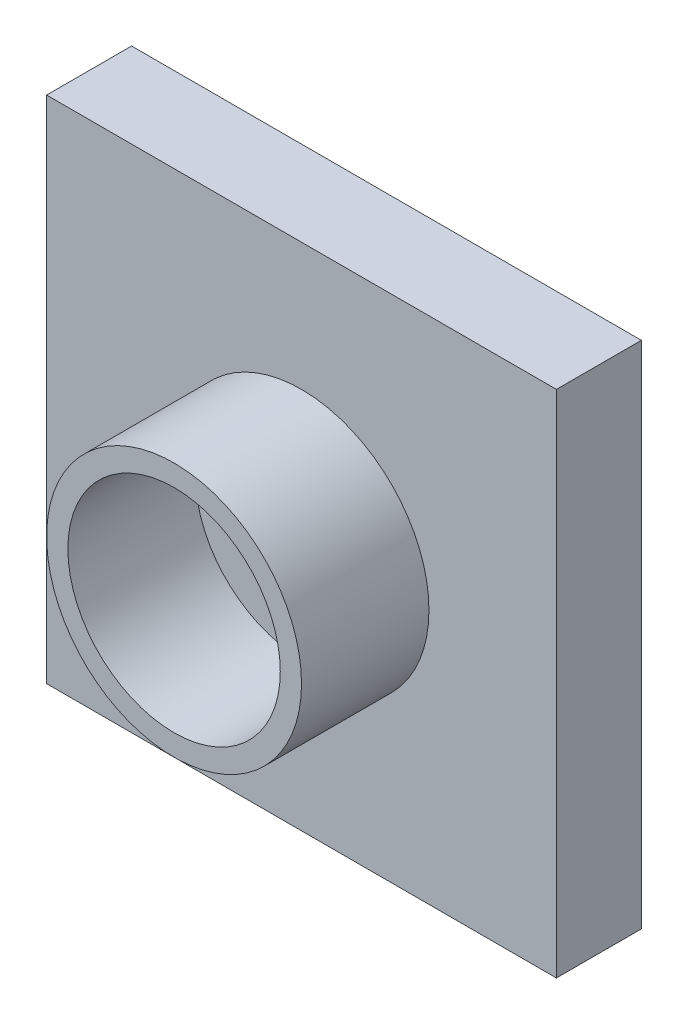
ISO-10303-21;
HEADER;
FILE_DESCRIPTION(('STEP AP214'),'2;1');
FILE_NAME('part.step','',(''),(''),'','','');
FILE_SCHEMA(('AUTOMOTIVE_DESIGN { 1 0 10303 214 1 1 1 1 }'));
ENDSEC;
DATA;
#1=APPLICATION_CONTEXT('core data for automotive mechanical design processes');
#2=APPLICATION_PROTOCOL_DEFINITION('international standard','automotive_design',2000,#1);
#3=PRODUCT_CONTEXT('',#1,'mechanical');
#4=PRODUCT('Part','Part','',(#3));
#5=PRODUCT_RELATED_PRODUCT_CATEGORY('part','',(#4));
#6=PRODUCT_DEFINITION_FORMATION('','',#4);
#7=PRODUCT_DEFINITION_CONTEXT('part definition',#1,'design');
#8=PRODUCT_DEFINITION('design','',#6,#7);
#9=PRODUCT_DEFINITION_SHAPE('','',#8);
#10=(LENGTH_UNIT() NAMED_UNIT(*) SI_UNIT(.MILLI.,.METRE.));
#11=(NAMED_UNIT(*) PLANE_ANGLE_UNIT() SI_UNIT($,.RADIAN.));
#12=(NAMED_UNIT(*) SI_UNIT($,.STERADIAN.) SOLID_ANGLE_UNIT());
#13=UNCERTAINTY_MEASURE_WITH_UNIT(LENGTH_MEASURE(1.E-05),#10,'distance_accuracy_value','');
#14=(GEOMETRIC_REPRESENTATION_CONTEXT(3) GLOBAL_UNCERTAINTY_ASSIGNED_CONTEXT((#13)) GLOBAL_UNIT_ASSIGNED_CONTEXT((#10,
#11,#12)) REPRESENTATION_CONTEXT('',''));
#15=CARTESIAN_POINT('',(0.,0.,0.));
#16=DIRECTION('',(0.,0.,1.));
#17=DIRECTION('',(1.,0.,0.));
#18=AXIS2_PLACEMENT_3D('',#15,#16,#17);
#19=CARTESIAN_POINT('',(6.,6.,2.));
#20=DIRECTION('',(-1.,0.,0.));
#21=DIRECTION('',(0.,-1.,0.));
#22=AXIS2_PLACEMENT_3D('',#19,#20,#21);
#23=PLANE('',#22);
#24=DIRECTION('',(0.,1.,0.));
#25=VECTOR('',#24,1.);
#26=CARTESIAN_POINT('',(6.,6.,0.));
#27=LINE('',#26,#25);
#28=CARTESIAN_POINT('',(6.,-6.,0.));
#29=VERTEX_POINT('',#28);
#30=CARTESIAN_POINT('',(6.,6.,0.));
#31=VERTEX_POINT('',#30);
#32=EDGE_CURVE('E105',#29,#31,#27,.T.);
#33=ORIENTED_EDGE('',*,*,#32,.T.);
#34=DIRECTION('',(0.,0.,-1.));
#35=VECTOR('',#34,1.);
#36=CARTESIAN_POINT('',(6.,6.,2.));
#37=LINE('',#36,#35);
#38=CARTESIAN_POINT('',(6.,6.,2.));
#39=VERTEX_POINT('',#38);
#40=EDGE_CURVE('E47',#39,#31,#37,.T.);
#41=ORIENTED_EDGE('',*,*,#40,.F.);
#42=DIRECTION('',(0.,1.,0.));
#43=VECTOR('',#42,1.);
#44=CARTESIAN_POINT('',(6.,6.,2.));
#45=LINE('',#44,#43);
#46=CARTESIAN_POINT('',(6.,-6.,2.));
#47=VERTEX_POINT('',#46);
#48=EDGE_CURVE('E91',#47,#39,#45,.T.);
#49=ORIENTED_EDGE('',*,*,#48,.F.);
#50=DIRECTION('',(0.,0.,-1.));
#51=VECTOR('',#50,1.);
#52=CARTESIAN_POINT('',(6.,-6.,2.));
#53=LINE('',#52,#51);
#54=EDGE_CURVE('E101',#47,#29,#53,.T.);
#55=ORIENTED_EDGE('',*,*,#54,.T.);
#56=EDGE_LOOP('',(#33,#41,#49,#55));
#57=FACE_BOUND('',#56,.T.);
#58=ADVANCED_FACE('F39',(#57),#23,.F.);
#59=CARTESIAN_POINT('',(-6.,6.,2.));
#60=DIRECTION('',(0.,-1.,0.));
#61=DIRECTION('',(0.,0.,-1.));
#62=AXIS2_PLACEMENT_3D('',#59,#60,#61);
#63=PLANE('',#62);
#64=DIRECTION('',(-1.,0.,0.));
#65=VECTOR('',#64,1.);
#66=CARTESIAN_POINT('',(-6.,6.,0.));
#67=LINE('',#66,#65);
#68=CARTESIAN_POINT('',(-6.,6.,0.));
#69=VERTEX_POINT('',#68);
#70=EDGE_CURVE('E96',#31,#69,#67,.T.);
#71=ORIENTED_EDGE('',*,*,#70,.T.);
#72=DIRECTION('',(0.,0.,-1.));
#73=VECTOR('',#72,1.);
#74=CARTESIAN_POINT('',(-6.,6.,2.));
#75=LINE('',#74,#73);
#76=CARTESIAN_POINT('',(-6.,6.,2.));
#77=VERTEX_POINT('',#76);
#78=EDGE_CURVE('E94',#77,#69,#75,.T.);
#79=ORIENTED_EDGE('',*,*,#78,.F.);
#80=DIRECTION('',(-1.,0.,0.));
#81=VECTOR('',#80,1.);
#82=CARTESIAN_POINT('',(-6.,6.,2.));
#83=LINE('',#82,#81);
#84=EDGE_CURVE('E86',#39,#77,#83,.T.);
#85=ORIENTED_EDGE('',*,*,#84,.F.);
#86=ORIENTED_EDGE('',*,*,#40,.T.);
#87=EDGE_LOOP('',(#71,#79,#85,#86));
#88=FACE_BOUND('',#87,.T.);
#89=ADVANCED_FACE('F95',(#88),#63,.F.);
#90=CARTESIAN_POINT('',(-6.,6.,2.));
#91=DIRECTION('',(1.,0.,0.));
#92=DIRECTION('',(0.,1.,0.));
#93=AXIS2_PLACEMENT_3D('',#90,#91,#92);
#94=PLANE('',#93);
#95=DIRECTION('',(0.,-1.,0.));
#96=VECTOR('',#95,1.);
#97=CARTESIAN_POINT('',(-6.,6.,0.));
#98=LINE('',#97,#96);
#99=CARTESIAN_POINT('',(-6.,-6.,0.));
#100=VERTEX_POINT('',#99);
#101=EDGE_CURVE('E72',#69,#100,#98,.T.);
#102=ORIENTED_EDGE('',*,*,#101,.T.);
#103=DIRECTION('',(0.,0.,-1.));
#104=VECTOR('',#103,1.);
#105=CARTESIAN_POINT('',(-6.,-6.,2.));
#106=LINE('',#105,#104);
#107=CARTESIAN_POINT('',(-6.,-6.,2.));
#108=VERTEX_POINT('',#107);
#109=EDGE_CURVE('E97',#108,#100,#106,.T.);
#110=ORIENTED_EDGE('',*,*,#109,.F.);
#111=DIRECTION('',(0.,-1.,0.));
#112=VECTOR('',#111,1.);
#113=CARTESIAN_POINT('',(-6.,6.,2.));
#114=LINE('',#113,#112);
#115=EDGE_CURVE('E89',#77,#108,#114,.T.);
#116=ORIENTED_EDGE('',*,*,#115,.F.);
#117=ORIENTED_EDGE('',*,*,#78,.T.);
#118=EDGE_LOOP('',(#102,#110,#116,#117));
#119=FACE_BOUND('',#118,.T.);
#120=ADVANCED_FACE('F99',(#119),#94,.F.);
#121=CARTESIAN_POINT('',(-6.,-6.,2.));
#122=DIRECTION('',(0.,1.,0.));
#123=DIRECTION('',(0.,0.,1.));
#124=AXIS2_PLACEMENT_3D('',#121,#122,#123);
#125=PLANE('',#124);
#126=DIRECTION('',(1.,0.,0.));
#127=VECTOR('',#126,1.);
#128=CARTESIAN_POINT('',(-6.,-6.,0.));
#129=LINE('',#128,#127);
#130=EDGE_CURVE('E78',#100,#29,#129,.T.);
#131=ORIENTED_EDGE('',*,*,#130,.T.);
#132=ORIENTED_EDGE('',*,*,#54,.F.);
#133=DIRECTION('',(1.,0.,0.));
#134=VECTOR('',#133,1.);
#135=CARTESIAN_POINT('',(-6.,-6.,2.));
#136=LINE('',#135,#134);
#137=EDGE_CURVE('E55',#108,#47,#136,.T.);
#138=ORIENTED_EDGE('',*,*,#137,.F.);
#139=ORIENTED_EDGE('',*,*,#109,.T.);
#140=EDGE_LOOP('',(#131,#132,#138,#139));
#141=FACE_BOUND('',#140,.T.);
#142=ADVANCED_FACE('F128',(#141),#125,.F.);
#143=CARTESIAN_POINT('',(0.,0.,2.));
#144=DIRECTION('',(0.,0.,1.));
#145=DIRECTION('',(1.,0.,0.));
#146=AXIS2_PLACEMENT_3D('',#143,#144,#145);
#147=PLANE('',#146);
#148=CARTESIAN_POINT('',(0.,0.,2.));
#149=DIRECTION('',(0.,0.,1.));
#150=DIRECTION('',(1.,0.,0.));
#151=AXIS2_PLACEMENT_3D('',#148,#149,#150);
#152=CIRCLE('',#151,3.);
#153=CARTESIAN_POINT('',(3.,0.,2.));
#154=VERTEX_POINT('',#153);
#155=EDGE_CURVE('E210',#154,#154,#152,.T.);
#156=ORIENTED_EDGE('',*,*,#155,.F.);
#157=EDGE_LOOP('',(#156));
#158=FACE_BOUND('',#157,.T.);
#159=ORIENTED_EDGE('',*,*,#48,.T.);
#160=ORIENTED_EDGE('',*,*,#84,.T.);
#161=ORIENTED_EDGE('',*,*,#115,.T.);
#162=ORIENTED_EDGE('',*,*,#137,.T.);
#163=EDGE_LOOP('',(#159,#160,#161,#162));
#164=FACE_BOUND('',#163,.T.);
#165=ADVANCED_FACE('F87',(#158,#164),#147,.T.);
#166=CARTESIAN_POINT('',(0.,0.,0.));
#167=DIRECTION('',(0.,0.,1.));
#168=DIRECTION('',(1.,0.,0.));
#169=AXIS2_PLACEMENT_3D('',#166,#167,#168);
#170=PLANE('',#169);
#171=ORIENTED_EDGE('',*,*,#32,.F.);
#172=ORIENTED_EDGE('',*,*,#130,.F.);
#173=ORIENTED_EDGE('',*,*,#101,.F.);
#174=ORIENTED_EDGE('',*,*,#70,.F.);
#175=EDGE_LOOP('',(#171,#172,#173,#174));
#176=FACE_BOUND('',#175,.T.);
#177=ADVANCED_FACE('F116',(#176),#170,.F.);
#178=CARTESIAN_POINT('',(0.,0.,5.));
#179=DIRECTION('',(0.,0.,1.));
#180=DIRECTION('',(1.,0.,0.));
#181=AXIS2_PLACEMENT_3D('',#178,#179,#180);
#182=PLANE('',#181);
#183=CARTESIAN_POINT('',(0.,0.,5.));
#184=DIRECTION('',(0.,0.,1.));
#185=DIRECTION('',(1.,0.,0.));
#186=AXIS2_PLACEMENT_3D('',#183,#184,#185);
#187=CIRCLE('',#186,3.);
#188=CARTESIAN_POINT('',(3.,0.,5.));
#189=VERTEX_POINT('',#188);
#190=EDGE_CURVE('E108',#189,#189,#187,.T.);
#191=ORIENTED_EDGE('',*,*,#190,.T.);
#192=EDGE_LOOP('',(#191));
#193=FACE_BOUND('',#192,.T.);
#194=CARTESIAN_POINT('',(0.,0.,5.));
#195=DIRECTION('',(0.,0.,1.));
#196=DIRECTION('',(1.,0.,0.));
#197=AXIS2_PLACEMENT_3D('',#194,#195,#196);
#198=CIRCLE('',#197,2.5);
#199=CARTESIAN_POINT('',(2.5,0.,5.));
#200=VERTEX_POINT('',#199);
#201=EDGE_CURVE('E207',#200,#200,#198,.T.);
#202=ORIENTED_EDGE('',*,*,#201,.F.);
#203=EDGE_LOOP('',(#202));
#204=FACE_BOUND('',#203,.T.);
#205=ADVANCED_FACE('F118',(#193,#204),#182,.T.);
#206=CARTESIAN_POINT('',(0.,0.,5.));
#207=DIRECTION('',(0.,0.,-1.));
#208=DIRECTION('',(-1.,0.,0.));
#209=AXIS2_PLACEMENT_3D('',#206,#207,#208);
#210=CYLINDRICAL_SURFACE('',#209,3.);
#211=ORIENTED_EDGE('',*,*,#190,.F.);
#212=EDGE_LOOP('',(#211));
#213=FACE_BOUND('',#212,.T.);
#214=ORIENTED_EDGE('',*,*,#155,.T.);
#215=EDGE_LOOP('',(#214));
#216=FACE_BOUND('',#215,.T.);
#217=ADVANCED_FACE('F125',(#213,#216),#210,.T.);
#218=CARTESIAN_POINT('',(0.,0.,5.));
#219=DIRECTION('',(0.,0.,-1.));
#220=DIRECTION('',(-1.,0.,0.));
#221=AXIS2_PLACEMENT_3D('',#218,#219,#220);
#222=CYLINDRICAL_SURFACE('',#221,2.5);
#223=ORIENTED_EDGE('',*,*,#201,.T.);
#224=EDGE_LOOP('',(#223));
#225=FACE_BOUND('',#224,.T.);
#226=CARTESIAN_POINT('',(0.,0.,2.));
#227=DIRECTION('',(0.,0.,1.));
#228=DIRECTION('',(1.,0.,0.));
#229=AXIS2_PLACEMENT_3D('',#226,#227,#228);
#230=CIRCLE('',#229,2.5);
#231=CARTESIAN_POINT('',(2.5,0.,2.));
#232=VERTEX_POINT('',#231);
#233=EDGE_CURVE('E11',#232,#232,#230,.F.);
#234=ORIENTED_EDGE('',*,*,#233,.T.);
#235=EDGE_LOOP('',(#234));
#236=FACE_BOUND('',#235,.T.);
#237=ADVANCED_FACE('F175',(#225,#236),#222,.F.);
#238=ORIENTED_EDGE('',*,*,#233,.F.);
#239=EDGE_LOOP('',(#238));
#240=FACE_BOUND('',#239,.T.);
#241=ADVANCED_FACE('F131',(#240),#147,.T.);
#242=CLOSED_SHELL('',(#58,#89,#120,#142,#165,#177,#205,#217,#237,#241));
#243=MANIFOLD_SOLID_BREP('B2',#242);
#244=ADVANCED_BREP_SHAPE_REPRESENTATION('',(#18,#243),#14);
#245=SHAPE_DEFINITION_REPRESENTATION(#9,#244);
ENDSEC;
END-ISO-10303-21;
